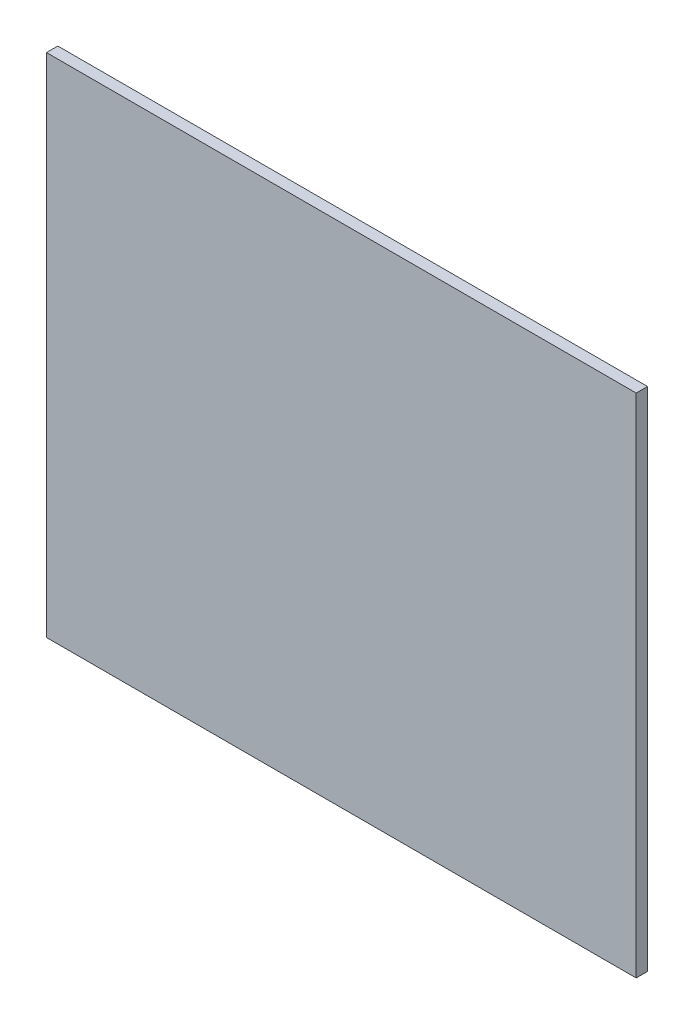
ISO-10303-21;
HEADER;
FILE_DESCRIPTION(('STEP AP214'),'2;1');
FILE_NAME('part.step','',(''),(''),'','','');
FILE_SCHEMA(('AUTOMOTIVE_DESIGN { 1 0 10303 214 1 1 1 1 }'));
ENDSEC;
DATA;
#1=APPLICATION_CONTEXT('core data for automotive mechanical design processes');
#2=APPLICATION_PROTOCOL_DEFINITION('international standard','automotive_design',2000,#1);
#3=PRODUCT_CONTEXT('',#1,'mechanical');
#4=PRODUCT('Part','Part','',(#3));
#5=PRODUCT_RELATED_PRODUCT_CATEGORY('part','',(#4));
#6=PRODUCT_DEFINITION_FORMATION('','',#4);
#7=PRODUCT_DEFINITION_CONTEXT('part definition',#1,'design');
#8=PRODUCT_DEFINITION('design','',#6,#7);
#9=PRODUCT_DEFINITION_SHAPE('','',#8);
#10=(LENGTH_UNIT() NAMED_UNIT(*) SI_UNIT(.MILLI.,.METRE.));
#11=(NAMED_UNIT(*) PLANE_ANGLE_UNIT() SI_UNIT($,.RADIAN.));
#12=(NAMED_UNIT(*) SI_UNIT($,.STERADIAN.) SOLID_ANGLE_UNIT());
#13=UNCERTAINTY_MEASURE_WITH_UNIT(LENGTH_MEASURE(1.E-05),#10,'distance_accuracy_value','');
#14=(GEOMETRIC_REPRESENTATION_CONTEXT(3) GLOBAL_UNCERTAINTY_ASSIGNED_CONTEXT((#13)) GLOBAL_UNIT_ASSIGNED_CONTEXT((#10,
#11,#12)) REPRESENTATION_CONTEXT('',''));
#15=CARTESIAN_POINT('',(0.,0.,0.));
#16=DIRECTION('',(0.,0.,1.));
#17=DIRECTION('',(1.,0.,0.));
#18=AXIS2_PLACEMENT_3D('',#15,#16,#17);
#19=CARTESIAN_POINT('',(39.,-33.5,1.5));
#20=DIRECTION('',(-1.,0.,0.));
#21=DIRECTION('',(0.,0.,1.));
#22=AXIS2_PLACEMENT_3D('',#19,#20,#21);
#23=PLANE('',#22);
#24=DIRECTION('',(0.,1.,0.));
#25=VECTOR('',#24,1.);
#26=CARTESIAN_POINT('',(39.,-33.5,0.));
#27=LINE('',#26,#25);
#28=CARTESIAN_POINT('',(39.,-33.5,0.));
#29=VERTEX_POINT('',#28);
#30=CARTESIAN_POINT('',(39.,33.5,0.));
#31=VERTEX_POINT('',#30);
#32=EDGE_CURVE('E98',#29,#31,#27,.T.);
#33=ORIENTED_EDGE('',*,*,#32,.T.);
#34=DIRECTION('',(0.,0.,-1.));
#35=VECTOR('',#34,1.);
#36=CARTESIAN_POINT('',(39.,33.5,1.5));
#37=LINE('',#36,#35);
#38=CARTESIAN_POINT('',(39.,33.5,1.5));
#39=VERTEX_POINT('',#38);
#40=EDGE_CURVE('E11',#39,#31,#37,.T.);
#41=ORIENTED_EDGE('',*,*,#40,.F.);
#42=DIRECTION('',(0.,1.,0.));
#43=VECTOR('',#42,1.);
#44=CARTESIAN_POINT('',(39.,-33.5,1.5));
#45=LINE('',#44,#43);
#46=CARTESIAN_POINT('',(39.,-33.5,1.5));
#47=VERTEX_POINT('',#46);
#48=EDGE_CURVE('E86',#47,#39,#45,.T.);
#49=ORIENTED_EDGE('',*,*,#48,.F.);
#50=DIRECTION('',(0.,0.,-1.));
#51=VECTOR('',#50,1.);
#52=CARTESIAN_POINT('',(39.,-33.5,1.5));
#53=LINE('',#52,#51);
#54=EDGE_CURVE('E94',#47,#29,#53,.T.);
#55=ORIENTED_EDGE('',*,*,#54,.T.);
#56=EDGE_LOOP('',(#33,#41,#49,#55));
#57=FACE_BOUND('',#56,.T.);
#58=ADVANCED_FACE('F35',(#57),#23,.F.);
#59=CARTESIAN_POINT('',(-39.,33.5,1.5));
#60=DIRECTION('',(0.,-1.,0.));
#61=DIRECTION('',(0.,0.,-1.));
#62=AXIS2_PLACEMENT_3D('',#59,#60,#61);
#63=PLANE('',#62);
#64=DIRECTION('',(-1.,0.,0.));
#65=VECTOR('',#64,1.);
#66=CARTESIAN_POINT('',(-39.,33.5,0.));
#67=LINE('',#66,#65);
#68=CARTESIAN_POINT('',(-39.,33.5,0.));
#69=VERTEX_POINT('',#68);
#70=EDGE_CURVE('E90',#31,#69,#67,.T.);
#71=ORIENTED_EDGE('',*,*,#70,.T.);
#72=DIRECTION('',(0.,0.,-1.));
#73=VECTOR('',#72,1.);
#74=CARTESIAN_POINT('',(-39.,33.5,1.5));
#75=LINE('',#74,#73);
#76=CARTESIAN_POINT('',(-39.,33.5,1.5));
#77=VERTEX_POINT('',#76);
#78=EDGE_CURVE('E43',#77,#69,#75,.T.);
#79=ORIENTED_EDGE('',*,*,#78,.F.);
#80=DIRECTION('',(-1.,0.,0.));
#81=VECTOR('',#80,1.);
#82=CARTESIAN_POINT('',(-39.,33.5,1.5));
#83=LINE('',#82,#81);
#84=EDGE_CURVE('E81',#39,#77,#83,.T.);
#85=ORIENTED_EDGE('',*,*,#84,.F.);
#86=ORIENTED_EDGE('',*,*,#40,.T.);
#87=EDGE_LOOP('',(#71,#79,#85,#86));
#88=FACE_BOUND('',#87,.T.);
#89=ADVANCED_FACE('F89',(#88),#63,.F.);
#90=CARTESIAN_POINT('',(-39.,-33.5,1.5));
#91=DIRECTION('',(1.,0.,0.));
#92=DIRECTION('',(0.,0.,-1.));
#93=AXIS2_PLACEMENT_3D('',#90,#91,#92);
#94=PLANE('',#93);
#95=DIRECTION('',(0.,-1.,0.));
#96=VECTOR('',#95,1.);
#97=CARTESIAN_POINT('',(-39.,-33.5,0.));
#98=LINE('',#97,#96);
#99=CARTESIAN_POINT('',(-39.,-33.5,0.));
#100=VERTEX_POINT('',#99);
#101=EDGE_CURVE('E68',#69,#100,#98,.T.);
#102=ORIENTED_EDGE('',*,*,#101,.T.);
#103=DIRECTION('',(0.,0.,-1.));
#104=VECTOR('',#103,1.);
#105=CARTESIAN_POINT('',(-39.,-33.5,1.5));
#106=LINE('',#105,#104);
#107=CARTESIAN_POINT('',(-39.,-33.5,1.5));
#108=VERTEX_POINT('',#107);
#109=EDGE_CURVE('E91',#108,#100,#106,.T.);
#110=ORIENTED_EDGE('',*,*,#109,.F.);
#111=DIRECTION('',(0.,-1.,0.));
#112=VECTOR('',#111,1.);
#113=CARTESIAN_POINT('',(-39.,-33.5,1.5));
#114=LINE('',#113,#112);
#115=EDGE_CURVE('E84',#77,#108,#114,.T.);
#116=ORIENTED_EDGE('',*,*,#115,.F.);
#117=ORIENTED_EDGE('',*,*,#78,.T.);
#118=EDGE_LOOP('',(#102,#110,#116,#117));
#119=FACE_BOUND('',#118,.T.);
#120=ADVANCED_FACE('F92',(#119),#94,.F.);
#121=CARTESIAN_POINT('',(-39.,-33.5,1.5));
#122=DIRECTION('',(0.,1.,0.));
#123=DIRECTION('',(0.,0.,1.));
#124=AXIS2_PLACEMENT_3D('',#121,#122,#123);
#125=PLANE('',#124);
#126=DIRECTION('',(1.,0.,0.));
#127=VECTOR('',#126,1.);
#128=CARTESIAN_POINT('',(-39.,-33.5,0.));
#129=LINE('',#128,#127);
#130=EDGE_CURVE('E74',#100,#29,#129,.T.);
#131=ORIENTED_EDGE('',*,*,#130,.T.);
#132=ORIENTED_EDGE('',*,*,#54,.F.);
#133=DIRECTION('',(1.,0.,0.));
#134=VECTOR('',#133,1.);
#135=CARTESIAN_POINT('',(-39.,-33.5,1.5));
#136=LINE('',#135,#134);
#137=EDGE_CURVE('E51',#108,#47,#136,.T.);
#138=ORIENTED_EDGE('',*,*,#137,.F.);
#139=ORIENTED_EDGE('',*,*,#109,.T.);
#140=EDGE_LOOP('',(#131,#132,#138,#139));
#141=FACE_BOUND('',#140,.T.);
#142=ADVANCED_FACE('F105',(#141),#125,.F.);
#143=CARTESIAN_POINT('',(0.,0.,1.5));
#144=DIRECTION('',(0.,0.,-1.));
#145=DIRECTION('',(-1.,0.,0.));
#146=AXIS2_PLACEMENT_3D('',#143,#144,#145);
#147=PLANE('',#146);
#148=ORIENTED_EDGE('',*,*,#48,.T.);
#149=ORIENTED_EDGE('',*,*,#84,.T.);
#150=ORIENTED_EDGE('',*,*,#115,.T.);
#151=ORIENTED_EDGE('',*,*,#137,.T.);
#152=EDGE_LOOP('',(#148,#149,#150,#151));
#153=FACE_BOUND('',#152,.T.);
#154=ADVANCED_FACE('F82',(#153),#147,.F.);
#155=CARTESIAN_POINT('',(0.,0.,0.));
#156=DIRECTION('',(0.,0.,-1.));
#157=DIRECTION('',(-1.,0.,0.));
#158=AXIS2_PLACEMENT_3D('',#155,#156,#157);
#159=PLANE('',#158);
#160=ORIENTED_EDGE('',*,*,#32,.F.);
#161=ORIENTED_EDGE('',*,*,#130,.F.);
#162=ORIENTED_EDGE('',*,*,#101,.F.);
#163=ORIENTED_EDGE('',*,*,#70,.F.);
#164=EDGE_LOOP('',(#160,#161,#162,#163));
#165=FACE_BOUND('',#164,.T.);
#166=ADVANCED_FACE('F108',(#165),#159,.T.);
#167=CLOSED_SHELL('',(#58,#89,#120,#142,#154,#166));
#168=MANIFOLD_SOLID_BREP('B2',#167);
#169=ADVANCED_BREP_SHAPE_REPRESENTATION('',(#18,#168),#14);
#170=SHAPE_DEFINITION_REPRESENTATION(#9,#169);
ENDSEC;
END-ISO-10303-21;
